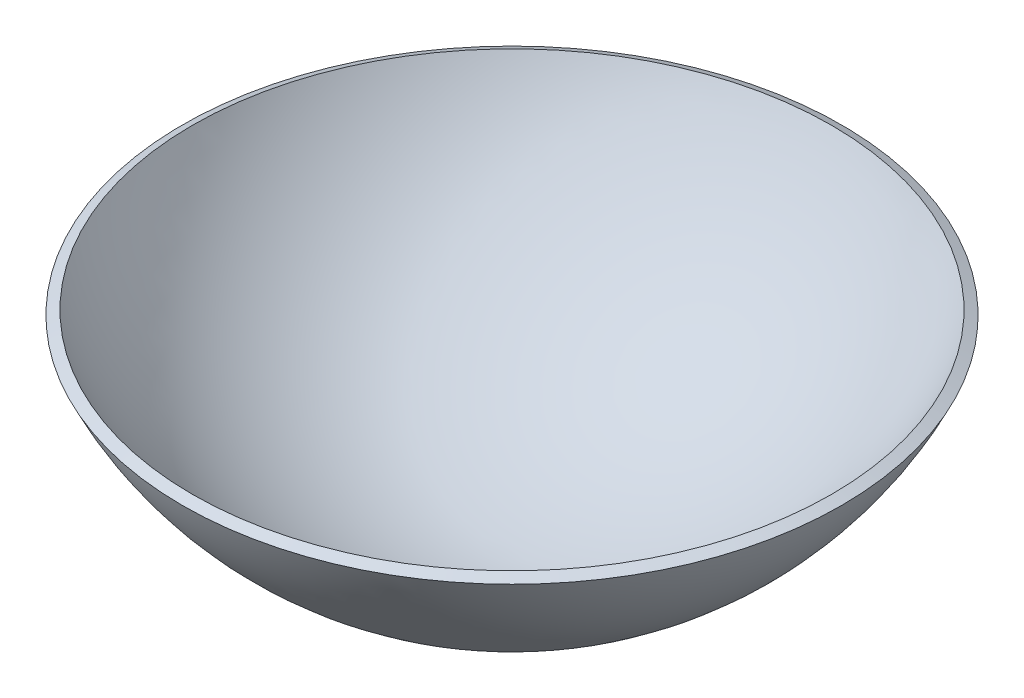
ISO-10303-21;
HEADER;
FILE_DESCRIPTION(('STEP AP214'),'2;1');
FILE_NAME('part.step','',(''),(''),'','','');
FILE_SCHEMA(('AUTOMOTIVE_DESIGN { 1 0 10303 214 1 1 1 1 }'));
ENDSEC;
DATA;
#1=APPLICATION_CONTEXT('core data for automotive mechanical design processes');
#2=APPLICATION_PROTOCOL_DEFINITION('international standard','automotive_design',2000,#1);
#3=PRODUCT_CONTEXT('',#1,'mechanical');
#4=PRODUCT('Part','Part','',(#3));
#5=PRODUCT_RELATED_PRODUCT_CATEGORY('part','',(#4));
#6=PRODUCT_DEFINITION_FORMATION('','',#4);
#7=PRODUCT_DEFINITION_CONTEXT('part definition',#1,'design');
#8=PRODUCT_DEFINITION('design','',#6,#7);
#9=PRODUCT_DEFINITION_SHAPE('','',#8);
#10=(LENGTH_UNIT() NAMED_UNIT(*) SI_UNIT(.MILLI.,.METRE.));
#11=(NAMED_UNIT(*) PLANE_ANGLE_UNIT() SI_UNIT($,.RADIAN.));
#12=(NAMED_UNIT(*) SI_UNIT($,.STERADIAN.) SOLID_ANGLE_UNIT());
#13=UNCERTAINTY_MEASURE_WITH_UNIT(LENGTH_MEASURE(1.E-05),#10,'distance_accuracy_value','');
#14=(GEOMETRIC_REPRESENTATION_CONTEXT(3) GLOBAL_UNCERTAINTY_ASSIGNED_CONTEXT((#13)) GLOBAL_UNIT_ASSIGNED_CONTEXT((#10,
#11,#12)) REPRESENTATION_CONTEXT('',''));
#15=CARTESIAN_POINT('',(0.,0.,0.));
#16=DIRECTION('',(0.,0.,1.));
#17=DIRECTION('',(1.,0.,0.));
#18=AXIS2_PLACEMENT_3D('',#15,#16,#17);
#19=CARTESIAN_POINT('',(0.,0.,0.));
#20=DIRECTION('',(0.,1.,0.));
#21=DIRECTION('',(1.,0.,0.));
#22=AXIS2_PLACEMENT_3D('',#19,#20,#21);
#23=SPHERICAL_SURFACE('',#22,84.077397424942);
#24=CARTESIAN_POINT('',(0.,-35.5326435514113,0.));
#25=DIRECTION('',(0.,1.,0.));
#26=DIRECTION('',(0.,0.,1.));
#27=AXIS2_PLACEMENT_3D('',#24,#25,#26);
#28=CIRCLE('',#27,76.2);
#29=CARTESIAN_POINT('',(0.,-35.5326435514113,76.2));
#30=VERTEX_POINT('',#29);
#31=EDGE_CURVE('E10',#30,#30,#28,.T.);
#32=ORIENTED_EDGE('',*,*,#31,.F.);
#33=EDGE_LOOP('',(#32));
#34=FACE_BOUND('',#33,.T.);
#35=ADVANCED_FACE('F31',(#34),#23,.T.);
#36=CARTESIAN_POINT('',(0.,-35.5326435514113,0.));
#37=DIRECTION('',(0.,-1.,0.));
#38=DIRECTION('',(0.,0.,-1.));
#39=AXIS2_PLACEMENT_3D('',#36,#37,#38);
#40=CONICAL_SURFACE('',#39,76.2,1.13446401379632);
#41=CARTESIAN_POINT('',(0.,-34.45919316659,0.));
#42=DIRECTION('',(0.,1.,0.));
#43=DIRECTION('',(0.,0.,1.));
#44=AXIS2_PLACEMENT_3D('',#41,#42,#43);
#45=CIRCLE('',#44,73.8979782209269);
#46=CARTESIAN_POINT('',(0.,-34.45919316659,73.8979782209269));
#47=VERTEX_POINT('',#46);
#48=EDGE_CURVE('E37',#47,#47,#45,.T.);
#49=ORIENTED_EDGE('',*,*,#48,.F.);
#50=EDGE_LOOP('',(#49));
#51=FACE_BOUND('',#50,.T.);
#52=ORIENTED_EDGE('',*,*,#31,.T.);
#53=EDGE_LOOP('',(#52));
#54=FACE_BOUND('',#53,.T.);
#55=ADVANCED_FACE('F45',(#51,#54),#40,.T.);
#56=CARTESIAN_POINT('',(0.,0.,0.));
#57=DIRECTION('',(0.,1.,0.));
#58=DIRECTION('',(1.,0.,0.));
#59=AXIS2_PLACEMENT_3D('',#56,#57,#58);
#60=SPHERICAL_SURFACE('',#59,81.5373974249421);
#61=ORIENTED_EDGE('',*,*,#48,.T.);
#62=EDGE_LOOP('',(#61));
#63=FACE_BOUND('',#62,.T.);
#64=ADVANCED_FACE('F43',(#63),#60,.F.);
#65=CLOSED_SHELL('',(#35,#55,#64));
#66=MANIFOLD_SOLID_BREP('B2',#65);
#67=ADVANCED_BREP_SHAPE_REPRESENTATION('',(#18,#66),#14);
#68=SHAPE_DEFINITION_REPRESENTATION(#9,#67);
ENDSEC;
END-ISO-10303-21;
